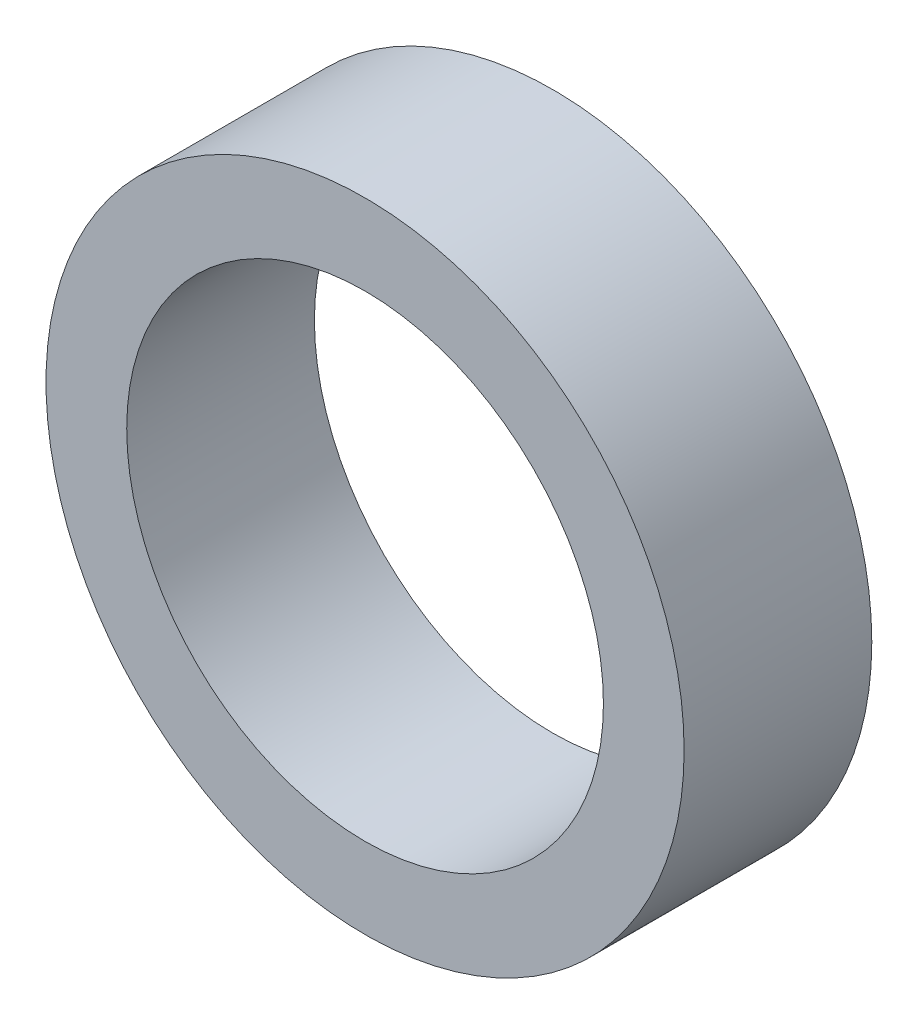
ISO-10303-21;
HEADER;
FILE_DESCRIPTION(('STEP AP214'),'2;1');
FILE_NAME('part.step','',(''),(''),'','','');
FILE_SCHEMA(('AUTOMOTIVE_DESIGN { 1 0 10303 214 1 1 1 1 }'));
ENDSEC;
DATA;
#1=APPLICATION_CONTEXT('core data for automotive mechanical design processes');
#2=APPLICATION_PROTOCOL_DEFINITION('international standard','automotive_design',2000,#1);
#3=PRODUCT_CONTEXT('',#1,'mechanical');
#4=PRODUCT('Part','Part','',(#3));
#5=PRODUCT_RELATED_PRODUCT_CATEGORY('part','',(#4));
#6=PRODUCT_DEFINITION_FORMATION('','',#4);
#7=PRODUCT_DEFINITION_CONTEXT('part definition',#1,'design');
#8=PRODUCT_DEFINITION('design','',#6,#7);
#9=PRODUCT_DEFINITION_SHAPE('','',#8);
#10=(LENGTH_UNIT() NAMED_UNIT(*) SI_UNIT(.MILLI.,.METRE.));
#11=(NAMED_UNIT(*) PLANE_ANGLE_UNIT() SI_UNIT($,.RADIAN.));
#12=(NAMED_UNIT(*) SI_UNIT($,.STERADIAN.) SOLID_ANGLE_UNIT());
#13=UNCERTAINTY_MEASURE_WITH_UNIT(LENGTH_MEASURE(1.E-05),#10,'distance_accuracy_value','');
#14=(GEOMETRIC_REPRESENTATION_CONTEXT(3) GLOBAL_UNCERTAINTY_ASSIGNED_CONTEXT((#13)) GLOBAL_UNIT_ASSIGNED_CONTEXT((#10,
#11,#12)) REPRESENTATION_CONTEXT('',''));
#15=CARTESIAN_POINT('',(0.,0.,0.));
#16=DIRECTION('',(0.,0.,1.));
#17=DIRECTION('',(1.,0.,0.));
#18=AXIS2_PLACEMENT_3D('',#15,#16,#17);
#19=CARTESIAN_POINT('',(0.,12.7,0.));
#20=DIRECTION('',(0.,0.,-1.));
#21=DIRECTION('',(-1.,0.,0.));
#22=AXIS2_PLACEMENT_3D('',#19,#20,#21);
#23=PLANE('',#22);
#24=CARTESIAN_POINT('',(0.,0.,0.));
#25=DIRECTION('',(0.,0.,1.));
#26=DIRECTION('',(1.,0.,0.));
#27=AXIS2_PLACEMENT_3D('',#24,#25,#26);
#28=CIRCLE('',#27,12.7);
#29=CARTESIAN_POINT('',(12.7,0.,0.));
#30=VERTEX_POINT('',#29);
#31=EDGE_CURVE('E45',#30,#30,#28,.T.);
#32=ORIENTED_EDGE('',*,*,#31,.F.);
#33=EDGE_LOOP('',(#32));
#34=FACE_BOUND('',#33,.T.);
#35=CARTESIAN_POINT('',(0.,0.,0.));
#36=DIRECTION('',(0.,0.,1.));
#37=DIRECTION('',(1.,0.,0.));
#38=AXIS2_PLACEMENT_3D('',#35,#36,#37);
#39=CIRCLE('',#38,17.);
#40=CARTESIAN_POINT('',(17.,0.,0.));
#41=VERTEX_POINT('',#40);
#42=EDGE_CURVE('E10',#41,#41,#39,.T.);
#43=ORIENTED_EDGE('',*,*,#42,.T.);
#44=EDGE_LOOP('',(#43));
#45=FACE_BOUND('',#44,.T.);
#46=ADVANCED_FACE('F31',(#34,#45),#23,.F.);
#47=CARTESIAN_POINT('',(0.,0.,0.));
#48=DIRECTION('',(0.,0.,1.));
#49=DIRECTION('',(1.,0.,0.));
#50=AXIS2_PLACEMENT_3D('',#47,#48,#49);
#51=CYLINDRICAL_SURFACE('',#50,17.);
#52=ORIENTED_EDGE('',*,*,#42,.F.);
#53=EDGE_LOOP('',(#52));
#54=FACE_BOUND('',#53,.T.);
#55=CARTESIAN_POINT('',(0.,0.,-10.));
#56=DIRECTION('',(0.,0.,1.));
#57=DIRECTION('',(1.,0.,0.));
#58=AXIS2_PLACEMENT_3D('',#55,#56,#57);
#59=CIRCLE('',#58,17.);
#60=CARTESIAN_POINT('',(17.,0.,-10.));
#61=VERTEX_POINT('',#60);
#62=EDGE_CURVE('E37',#61,#61,#59,.T.);
#63=ORIENTED_EDGE('',*,*,#62,.T.);
#64=EDGE_LOOP('',(#63));
#65=FACE_BOUND('',#64,.T.);
#66=ADVANCED_FACE('F54',(#54,#65),#51,.T.);
#67=CARTESIAN_POINT('',(0.,12.7,-10.));
#68=DIRECTION('',(0.,0.,1.));
#69=DIRECTION('',(1.,0.,0.));
#70=AXIS2_PLACEMENT_3D('',#67,#68,#69);
#71=PLANE('',#70);
#72=ORIENTED_EDGE('',*,*,#62,.F.);
#73=EDGE_LOOP('',(#72));
#74=FACE_BOUND('',#73,.T.);
#75=CARTESIAN_POINT('',(0.,0.,-10.));
#76=DIRECTION('',(0.,0.,1.));
#77=DIRECTION('',(1.,0.,0.));
#78=AXIS2_PLACEMENT_3D('',#75,#76,#77);
#79=CIRCLE('',#78,12.7);
#80=CARTESIAN_POINT('',(12.7,0.,-10.));
#81=VERTEX_POINT('',#80);
#82=EDGE_CURVE('E41',#81,#81,#79,.T.);
#83=ORIENTED_EDGE('',*,*,#82,.T.);
#84=EDGE_LOOP('',(#83));
#85=FACE_BOUND('',#84,.T.);
#86=ADVANCED_FACE('F58',(#74,#85),#71,.F.);
#87=CARTESIAN_POINT('',(0.,0.,0.));
#88=DIRECTION('',(0.,0.,1.));
#89=DIRECTION('',(1.,0.,0.));
#90=AXIS2_PLACEMENT_3D('',#87,#88,#89);
#91=CYLINDRICAL_SURFACE('',#90,12.7);
#92=ORIENTED_EDGE('',*,*,#82,.F.);
#93=EDGE_LOOP('',(#92));
#94=FACE_BOUND('',#93,.T.);
#95=ORIENTED_EDGE('',*,*,#31,.T.);
#96=EDGE_LOOP('',(#95));
#97=FACE_BOUND('',#96,.T.);
#98=ADVANCED_FACE('F51',(#94,#97),#91,.F.);
#99=CLOSED_SHELL('',(#46,#66,#86,#98));
#100=MANIFOLD_SOLID_BREP('B2',#99);
#101=ADVANCED_BREP_SHAPE_REPRESENTATION('',(#18,#100),#14);
#102=SHAPE_DEFINITION_REPRESENTATION(#9,#101);
ENDSEC;
END-ISO-10303-21;
